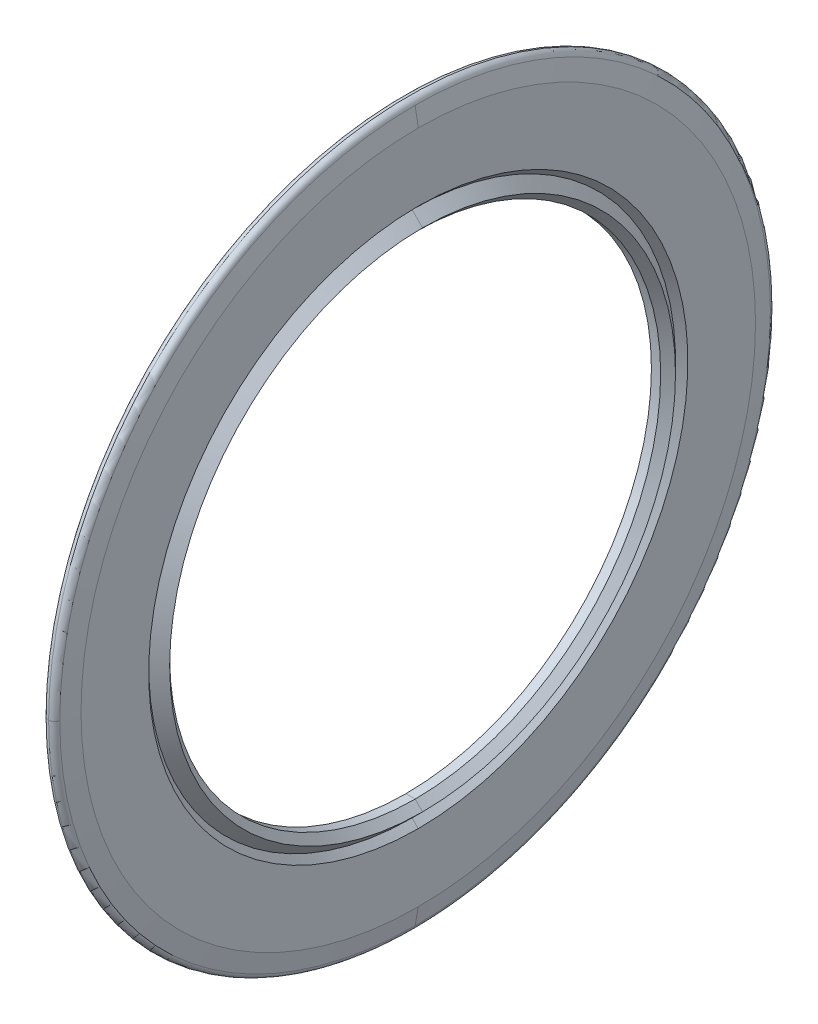
ISO-10303-21;
HEADER;
FILE_DESCRIPTION(('STEP AP214'),'2;1');
FILE_NAME('part.step','',(''),(''),'','','');
FILE_SCHEMA(('AUTOMOTIVE_DESIGN { 1 0 10303 214 1 1 1 1 }'));
ENDSEC;
DATA;
#1=APPLICATION_CONTEXT('core data for automotive mechanical design processes');
#2=APPLICATION_PROTOCOL_DEFINITION('international standard','automotive_design',2000,#1);
#3=PRODUCT_CONTEXT('',#1,'mechanical');
#4=PRODUCT('Part','Part','',(#3));
#5=PRODUCT_RELATED_PRODUCT_CATEGORY('part','',(#4));
#6=PRODUCT_DEFINITION_FORMATION('','',#4);
#7=PRODUCT_DEFINITION_CONTEXT('part definition',#1,'design');
#8=PRODUCT_DEFINITION('design','',#6,#7);
#9=PRODUCT_DEFINITION_SHAPE('','',#8);
#10=(LENGTH_UNIT() NAMED_UNIT(*) SI_UNIT(.MILLI.,.METRE.));
#11=(NAMED_UNIT(*) PLANE_ANGLE_UNIT() SI_UNIT($,.RADIAN.));
#12=(NAMED_UNIT(*) SI_UNIT($,.STERADIAN.) SOLID_ANGLE_UNIT());
#13=UNCERTAINTY_MEASURE_WITH_UNIT(LENGTH_MEASURE(1.E-05),#10,'distance_accuracy_value','');
#14=(GEOMETRIC_REPRESENTATION_CONTEXT(3) GLOBAL_UNCERTAINTY_ASSIGNED_CONTEXT((#13)) GLOBAL_UNIT_ASSIGNED_CONTEXT((#10,
#11,#12)) REPRESENTATION_CONTEXT('',''));
#15=CARTESIAN_POINT('',(0.,0.,0.));
#16=DIRECTION('',(0.,0.,1.));
#17=DIRECTION('',(1.,0.,0.));
#18=AXIS2_PLACEMENT_3D('',#15,#16,#17);
#19=CARTESIAN_POINT('',(0.23,25.73235,0.));
#20=DIRECTION('',(-1.,0.,0.));
#21=DIRECTION('',(0.,0.,1.));
#22=AXIS2_PLACEMENT_3D('',#19,#20,#21);
#23=PLANE('',#22);
#24=CARTESIAN_POINT('',(0.23,0.,0.));
#25=DIRECTION('',(1.,0.,0.));
#26=DIRECTION('',(0.,1.,0.));
#27=AXIS2_PLACEMENT_3D('',#24,#25,#26);
#28=CIRCLE('',#27,25.08835);
#29=CARTESIAN_POINT('',(0.23,25.08835,0.));
#30=VERTEX_POINT('',#29);
#31=CARTESIAN_POINT('',(0.23,-25.08835,0.));
#32=VERTEX_POINT('',#31);
#33=EDGE_CURVE('E11',#30,#32,#28,.T.);
#34=ORIENTED_EDGE('',*,*,#33,.T.);
#35=CARTESIAN_POINT('',(0.23,0.,0.));
#36=DIRECTION('',(1.,0.,0.));
#37=DIRECTION('',(0.,1.,0.));
#38=AXIS2_PLACEMENT_3D('',#35,#36,#37);
#39=CIRCLE('',#38,25.08835);
#40=EDGE_CURVE('E250',#32,#30,#39,.T.);
#41=ORIENTED_EDGE('',*,*,#40,.T.);
#42=EDGE_LOOP('',(#34,#41));
#43=FACE_BOUND('',#42,.T.);
#44=CARTESIAN_POINT('',(0.23,0.,0.));
#45=DIRECTION('',(1.,0.,0.));
#46=DIRECTION('',(0.,1.,0.));
#47=AXIS2_PLACEMENT_3D('',#44,#45,#46);
#48=CIRCLE('',#47,26.37635);
#49=CARTESIAN_POINT('',(0.23,0.,-26.37635));
#50=VERTEX_POINT('',#49);
#51=CARTESIAN_POINT('',(0.23,0.,26.37635));
#52=VERTEX_POINT('',#51);
#53=EDGE_CURVE('E271',#50,#52,#48,.T.);
#54=ORIENTED_EDGE('',*,*,#53,.F.);
#55=CARTESIAN_POINT('',(0.23,0.,0.));
#56=DIRECTION('',(1.,0.,0.));
#57=DIRECTION('',(0.,1.,0.));
#58=AXIS2_PLACEMENT_3D('',#55,#56,#57);
#59=CIRCLE('',#58,26.37635);
#60=EDGE_CURVE('E276',#52,#50,#59,.T.);
#61=ORIENTED_EDGE('',*,*,#60,.F.);
#62=EDGE_LOOP('',(#54,#61));
#63=FACE_BOUND('',#62,.T.);
#64=ADVANCED_FACE('F16',(#43,#63),#23,.T.);
#65=CARTESIAN_POINT('',(0.345,0.,0.));
#66=DIRECTION('',(-1.,0.,0.));
#67=DIRECTION('',(0.,1.,0.));
#68=AXIS2_PLACEMENT_3D('',#65,#66,#67);
#69=CONICAL_SURFACE('',#68,24.97335,0.785398163397448);
#70=DIRECTION('',(0.707106781186548,-0.707106781186547,0.));
#71=VECTOR('',#70,1.);
#72=CARTESIAN_POINT('',(0.345,24.97335,0.));
#73=LINE('',#72,#71);
#74=CARTESIAN_POINT('',(0.46,24.85835,0.));
#75=VERTEX_POINT('',#74);
#76=EDGE_CURVE('E240',#30,#75,#73,.T.);
#77=ORIENTED_EDGE('',*,*,#76,.T.);
#78=CARTESIAN_POINT('',(0.46,0.,0.));
#79=DIRECTION('',(1.,0.,0.));
#80=DIRECTION('',(0.,1.,0.));
#81=AXIS2_PLACEMENT_3D('',#78,#79,#80);
#82=CIRCLE('',#81,24.85835);
#83=CARTESIAN_POINT('',(0.46,-24.85835,0.));
#84=VERTEX_POINT('',#83);
#85=EDGE_CURVE('E23',#75,#84,#82,.T.);
#86=ORIENTED_EDGE('',*,*,#85,.T.);
#87=DIRECTION('',(-0.707106781186548,-0.707106781186547,0.));
#88=VECTOR('',#87,1.);
#89=CARTESIAN_POINT('',(0.345,-24.97335,0.));
#90=LINE('',#89,#88);
#91=EDGE_CURVE('E237',#84,#32,#90,.T.);
#92=ORIENTED_EDGE('',*,*,#91,.T.);
#93=ORIENTED_EDGE('',*,*,#33,.F.);
#94=EDGE_LOOP('',(#77,#86,#92,#93));
#95=FACE_BOUND('',#94,.T.);
#96=ADVANCED_FACE('F235',(#95),#69,.F.);
#97=CARTESIAN_POINT('',(0.46,22.67335,0.));
#98=DIRECTION('',(-1.,0.,0.));
#99=DIRECTION('',(0.,0.,1.));
#100=AXIS2_PLACEMENT_3D('',#97,#98,#99);
#101=PLANE('',#100);
#102=CARTESIAN_POINT('',(0.46,0.,0.));
#103=DIRECTION('',(1.,0.,0.));
#104=DIRECTION('',(0.,1.,0.));
#105=AXIS2_PLACEMENT_3D('',#102,#103,#104);
#106=CIRCLE('',#105,20.48835);
#107=CARTESIAN_POINT('',(0.46,20.48835,0.));
#108=VERTEX_POINT('',#107);
#109=CARTESIAN_POINT('',(0.46,-20.48835,0.));
#110=VERTEX_POINT('',#109);
#111=EDGE_CURVE('E263',#108,#110,#106,.T.);
#112=ORIENTED_EDGE('',*,*,#111,.T.);
#113=CARTESIAN_POINT('',(0.46,0.,0.));
#114=DIRECTION('',(1.,0.,0.));
#115=DIRECTION('',(0.,1.,0.));
#116=AXIS2_PLACEMENT_3D('',#113,#114,#115);
#117=CIRCLE('',#116,20.48835);
#118=EDGE_CURVE('E169',#110,#108,#117,.T.);
#119=ORIENTED_EDGE('',*,*,#118,.T.);
#120=EDGE_LOOP('',(#112,#119));
#121=FACE_BOUND('',#120,.T.);
#122=ORIENTED_EDGE('',*,*,#85,.F.);
#123=CARTESIAN_POINT('',(0.46,0.,0.));
#124=DIRECTION('',(1.,0.,0.));
#125=DIRECTION('',(0.,1.,0.));
#126=AXIS2_PLACEMENT_3D('',#123,#124,#125);
#127=CIRCLE('',#126,24.85835);
#128=EDGE_CURVE('E243',#84,#75,#127,.T.);
#129=ORIENTED_EDGE('',*,*,#128,.F.);
#130=EDGE_LOOP('',(#122,#129));
#131=FACE_BOUND('',#130,.T.);
#132=ADVANCED_FACE('F244',(#121,#131),#101,.T.);
#133=CARTESIAN_POINT('',(0.345,0.,0.));
#134=DIRECTION('',(1.,0.,0.));
#135=DIRECTION('',(0.,1.,0.));
#136=AXIS2_PLACEMENT_3D('',#133,#134,#135);
#137=CONICAL_SURFACE('',#136,20.37335,0.785398163397448);
#138=DIRECTION('',(0.707106781186548,0.707106781186547,0.));
#139=VECTOR('',#138,1.);
#140=CARTESIAN_POINT('',(0.345,20.37335,0.));
#141=LINE('',#140,#139);
#142=CARTESIAN_POINT('',(0.23,20.25835,0.));
#143=VERTEX_POINT('',#142);
#144=EDGE_CURVE('E246',#143,#108,#141,.T.);
#145=ORIENTED_EDGE('',*,*,#144,.T.);
#146=ORIENTED_EDGE('',*,*,#118,.F.);
#147=DIRECTION('',(-0.707106781186548,0.707106781186547,0.));
#148=VECTOR('',#147,1.);
#149=CARTESIAN_POINT('',(0.345,-20.37335,0.));
#150=LINE('',#149,#148);
#151=CARTESIAN_POINT('',(0.23,-20.25835,0.));
#152=VERTEX_POINT('',#151);
#153=EDGE_CURVE('E257',#110,#152,#150,.T.);
#154=ORIENTED_EDGE('',*,*,#153,.T.);
#155=CARTESIAN_POINT('',(0.23,0.,0.));
#156=DIRECTION('',(1.,0.,0.));
#157=DIRECTION('',(0.,1.,0.));
#158=AXIS2_PLACEMENT_3D('',#155,#156,#157);
#159=CIRCLE('',#158,20.25835);
#160=EDGE_CURVE('E171',#152,#143,#159,.T.);
#161=ORIENTED_EDGE('',*,*,#160,.T.);
#162=EDGE_LOOP('',(#145,#146,#154,#161));
#163=FACE_BOUND('',#162,.T.);
#164=ADVANCED_FACE('F286',(#163),#137,.T.);
#165=CARTESIAN_POINT('',(0.23,19.93635,0.));
#166=DIRECTION('',(-1.,0.,0.));
#167=DIRECTION('',(0.,0.,1.));
#168=AXIS2_PLACEMENT_3D('',#165,#166,#167);
#169=PLANE('',#168);
#170=CARTESIAN_POINT('',(0.23,0.,0.));
#171=DIRECTION('',(1.,0.,0.));
#172=DIRECTION('',(0.,1.,0.));
#173=AXIS2_PLACEMENT_3D('',#170,#171,#172);
#174=CIRCLE('',#173,19.61435);
#175=CARTESIAN_POINT('',(0.23,19.61435,0.));
#176=VERTEX_POINT('',#175);
#177=CARTESIAN_POINT('',(0.23,-19.61435,0.));
#178=VERTEX_POINT('',#177);
#179=EDGE_CURVE('E230',#176,#178,#174,.T.);
#180=ORIENTED_EDGE('',*,*,#179,.T.);
#181=CARTESIAN_POINT('',(0.23,0.,0.));
#182=DIRECTION('',(1.,0.,0.));
#183=DIRECTION('',(0.,1.,0.));
#184=AXIS2_PLACEMENT_3D('',#181,#182,#183);
#185=CIRCLE('',#184,19.61435);
#186=EDGE_CURVE('E156',#178,#176,#185,.T.);
#187=ORIENTED_EDGE('',*,*,#186,.T.);
#188=EDGE_LOOP('',(#180,#187));
#189=FACE_BOUND('',#188,.T.);
#190=CARTESIAN_POINT('',(0.23,0.,0.));
#191=DIRECTION('',(1.,0.,0.));
#192=DIRECTION('',(0.,1.,0.));
#193=AXIS2_PLACEMENT_3D('',#190,#191,#192);
#194=CIRCLE('',#193,20.25835);
#195=EDGE_CURVE('E255',#143,#152,#194,.T.);
#196=ORIENTED_EDGE('',*,*,#195,.F.);
#197=ORIENTED_EDGE('',*,*,#160,.F.);
#198=EDGE_LOOP('',(#196,#197));
#199=FACE_BOUND('',#198,.T.);
#200=ADVANCED_FACE('F288',(#189,#199),#169,.T.);
#201=CARTESIAN_POINT('',(0.6206625,0.,0.));
#202=DIRECTION('',(-1.,0.,0.));
#203=DIRECTION('',(0.,1.,0.));
#204=AXIS2_PLACEMENT_3D('',#201,#202,#203);
#205=CONICAL_SURFACE('',#204,19.2236875,0.78539816339745);
#206=DIRECTION('',(0.707106781186547,-0.707106781186548,0.));
#207=VECTOR('',#206,1.);
#208=CARTESIAN_POINT('',(0.6206625,19.2236875,0.));
#209=LINE('',#208,#207);
#210=CARTESIAN_POINT('',(1.011325,18.833025,0.));
#211=VERTEX_POINT('',#210);
#212=EDGE_CURVE('E133',#176,#211,#209,.T.);
#213=ORIENTED_EDGE('',*,*,#212,.T.);
#214=CARTESIAN_POINT('',(1.011325,0.,0.));
#215=DIRECTION('',(1.,0.,0.));
#216=DIRECTION('',(0.,1.,0.));
#217=AXIS2_PLACEMENT_3D('',#214,#215,#216);
#218=CIRCLE('',#217,18.833025);
#219=CARTESIAN_POINT('',(1.011325,-18.833025,0.));
#220=VERTEX_POINT('',#219);
#221=EDGE_CURVE('E126',#211,#220,#218,.T.);
#222=ORIENTED_EDGE('',*,*,#221,.T.);
#223=DIRECTION('',(-0.707106781186547,-0.707106781186548,0.));
#224=VECTOR('',#223,1.);
#225=CARTESIAN_POINT('',(0.6206625,-19.2236875,0.));
#226=LINE('',#225,#224);
#227=EDGE_CURVE('E130',#220,#178,#226,.T.);
#228=ORIENTED_EDGE('',*,*,#227,.T.);
#229=ORIENTED_EDGE('',*,*,#179,.F.);
#230=EDGE_LOOP('',(#213,#222,#228,#229));
#231=FACE_BOUND('',#230,.T.);
#232=ADVANCED_FACE('F128',(#231),#205,.F.);
#233=CARTESIAN_POINT('',(0.7356625,0.,0.));
#234=DIRECTION('',(1.,0.,0.));
#235=DIRECTION('',(0.,1.,0.));
#236=AXIS2_PLACEMENT_3D('',#233,#234,#235);
#237=CONICAL_SURFACE('',#236,18.5573625,0.785398163397447);
#238=DIRECTION('',(0.707106781186548,0.707106781186547,0.));
#239=VECTOR('',#238,1.);
#240=CARTESIAN_POINT('',(0.7356625,18.5573625,0.));
#241=LINE('',#240,#239);
#242=CARTESIAN_POINT('',(0.46,18.2817,0.));
#243=VERTEX_POINT('',#242);
#244=EDGE_CURVE('E151',#243,#211,#241,.T.);
#245=ORIENTED_EDGE('',*,*,#244,.T.);
#246=CARTESIAN_POINT('',(1.011325,0.,0.));
#247=DIRECTION('',(1.,0.,0.));
#248=DIRECTION('',(0.,1.,0.));
#249=AXIS2_PLACEMENT_3D('',#246,#247,#248);
#250=CIRCLE('',#249,18.833025);
#251=EDGE_CURVE('E149',#220,#211,#250,.T.);
#252=ORIENTED_EDGE('',*,*,#251,.F.);
#253=DIRECTION('',(-0.707106781186548,0.707106781186547,0.));
#254=VECTOR('',#253,1.);
#255=CARTESIAN_POINT('',(0.7356625,-18.5573625,0.));
#256=LINE('',#255,#254);
#257=CARTESIAN_POINT('',(0.46,-18.2817,0.));
#258=VERTEX_POINT('',#257);
#259=EDGE_CURVE('E138',#220,#258,#256,.T.);
#260=ORIENTED_EDGE('',*,*,#259,.T.);
#261=CARTESIAN_POINT('',(0.46,0.,0.));
#262=DIRECTION('',(1.,0.,0.));
#263=DIRECTION('',(0.,1.,0.));
#264=AXIS2_PLACEMENT_3D('',#261,#262,#263);
#265=CIRCLE('',#264,18.2817);
#266=EDGE_CURVE('E166',#258,#243,#265,.T.);
#267=ORIENTED_EDGE('',*,*,#266,.T.);
#268=EDGE_LOOP('',(#245,#252,#260,#267));
#269=FACE_BOUND('',#268,.T.);
#270=ADVANCED_FACE('F150',(#269),#237,.T.);
#271=CARTESIAN_POINT('',(0.805,0.,0.));
#272=DIRECTION('',(1.,0.,0.));
#273=DIRECTION('',(0.,1.,0.));
#274=AXIS2_PLACEMENT_3D('',#271,#272,#273);
#275=CYLINDRICAL_SURFACE('',#274,18.2817);
#276=DIRECTION('',(1.,0.,0.));
#277=VECTOR('',#276,1.);
#278=CARTESIAN_POINT('',(0.805,18.2817,0.));
#279=LINE('',#278,#277);
#280=CARTESIAN_POINT('',(1.15,18.2817,0.));
#281=VERTEX_POINT('',#280);
#282=EDGE_CURVE('E137',#243,#281,#279,.T.);
#283=ORIENTED_EDGE('',*,*,#282,.T.);
#284=CARTESIAN_POINT('',(1.15,0.,0.));
#285=DIRECTION('',(1.,0.,0.));
#286=DIRECTION('',(0.,1.,0.));
#287=AXIS2_PLACEMENT_3D('',#284,#285,#286);
#288=CIRCLE('',#287,18.2817);
#289=CARTESIAN_POINT('',(1.15,-18.2817,0.));
#290=VERTEX_POINT('',#289);
#291=EDGE_CURVE('E228',#281,#290,#288,.T.);
#292=ORIENTED_EDGE('',*,*,#291,.T.);
#293=DIRECTION('',(-1.,0.,0.));
#294=VECTOR('',#293,1.);
#295=CARTESIAN_POINT('',(0.805,-18.2817,0.));
#296=LINE('',#295,#294);
#297=EDGE_CURVE('E168',#290,#258,#296,.T.);
#298=ORIENTED_EDGE('',*,*,#297,.T.);
#299=CARTESIAN_POINT('',(0.46,0.,0.));
#300=DIRECTION('',(1.,0.,0.));
#301=DIRECTION('',(0.,1.,0.));
#302=AXIS2_PLACEMENT_3D('',#299,#300,#301);
#303=CIRCLE('',#302,18.2817);
#304=EDGE_CURVE('E145',#243,#258,#303,.T.);
#305=ORIENTED_EDGE('',*,*,#304,.F.);
#306=EDGE_LOOP('',(#283,#292,#298,#305));
#307=FACE_BOUND('',#306,.T.);
#308=ADVANCED_FACE('F347',(#307),#275,.F.);
#309=CARTESIAN_POINT('',(1.4256625,0.,0.));
#310=DIRECTION('',(1.,0.,0.));
#311=DIRECTION('',(0.,1.,0.));
#312=AXIS2_PLACEMENT_3D('',#309,#310,#311);
#313=CONICAL_SURFACE('',#312,18.5573625,0.785398163397451);
#314=DIRECTION('',(0.707106781186546,0.707106781186549,0.));
#315=VECTOR('',#314,1.);
#316=CARTESIAN_POINT('',(1.4256625,18.5573625,0.));
#317=LINE('',#316,#315);
#318=CARTESIAN_POINT('',(1.701325,18.833025,0.));
#319=VERTEX_POINT('',#318);
#320=EDGE_CURVE('E176',#281,#319,#317,.T.);
#321=ORIENTED_EDGE('',*,*,#320,.T.);
#322=CARTESIAN_POINT('',(1.701325,0.,0.));
#323=DIRECTION('',(1.,0.,0.));
#324=DIRECTION('',(0.,1.,0.));
#325=AXIS2_PLACEMENT_3D('',#322,#323,#324);
#326=CIRCLE('',#325,18.833025);
#327=CARTESIAN_POINT('',(1.701325,-18.833025,0.));
#328=VERTEX_POINT('',#327);
#329=EDGE_CURVE('E194',#319,#328,#326,.T.);
#330=ORIENTED_EDGE('',*,*,#329,.T.);
#331=DIRECTION('',(-0.707106781186546,0.707106781186549,0.));
#332=VECTOR('',#331,1.);
#333=CARTESIAN_POINT('',(1.4256625,-18.5573625,0.));
#334=LINE('',#333,#332);
#335=EDGE_CURVE('E179',#328,#290,#334,.T.);
#336=ORIENTED_EDGE('',*,*,#335,.T.);
#337=ORIENTED_EDGE('',*,*,#291,.F.);
#338=EDGE_LOOP('',(#321,#330,#336,#337));
#339=FACE_BOUND('',#338,.T.);
#340=ADVANCED_FACE('F344',(#339),#313,.F.);
#341=CARTESIAN_POINT('',(1.3106625,0.,0.));
#342=DIRECTION('',(-1.,0.,0.));
#343=DIRECTION('',(0.,1.,0.));
#344=AXIS2_PLACEMENT_3D('',#341,#342,#343);
#345=CONICAL_SURFACE('',#344,19.2236875,0.785398163397448);
#346=DIRECTION('',(0.707106781186548,-0.707106781186547,0.));
#347=VECTOR('',#346,1.);
#348=CARTESIAN_POINT('',(1.3106625,19.2236875,0.));
#349=LINE('',#348,#347);
#350=CARTESIAN_POINT('',(0.92,19.61435,0.));
#351=VERTEX_POINT('',#350);
#352=EDGE_CURVE('E185',#351,#319,#349,.T.);
#353=ORIENTED_EDGE('',*,*,#352,.T.);
#354=CARTESIAN_POINT('',(1.701325,0.,0.));
#355=DIRECTION('',(1.,0.,0.));
#356=DIRECTION('',(0.,1.,0.));
#357=AXIS2_PLACEMENT_3D('',#354,#355,#356);
#358=CIRCLE('',#357,18.833025);
#359=EDGE_CURVE('E182',#328,#319,#358,.T.);
#360=ORIENTED_EDGE('',*,*,#359,.F.);
#361=DIRECTION('',(-0.707106781186548,-0.707106781186547,0.));
#362=VECTOR('',#361,1.);
#363=CARTESIAN_POINT('',(1.3106625,-19.2236875,0.));
#364=LINE('',#363,#362);
#365=CARTESIAN_POINT('',(0.92,-19.61435,0.));
#366=VERTEX_POINT('',#365);
#367=EDGE_CURVE('E191',#328,#366,#364,.T.);
#368=ORIENTED_EDGE('',*,*,#367,.T.);
#369=CARTESIAN_POINT('',(0.92,0.,0.));
#370=DIRECTION('',(1.,0.,0.));
#371=DIRECTION('',(0.,1.,0.));
#372=AXIS2_PLACEMENT_3D('',#369,#370,#371);
#373=CIRCLE('',#372,19.61435);
#374=EDGE_CURVE('E199',#366,#351,#373,.T.);
#375=ORIENTED_EDGE('',*,*,#374,.T.);
#376=EDGE_LOOP('',(#353,#360,#368,#375));
#377=FACE_BOUND('',#376,.T.);
#378=ADVANCED_FACE('F339',(#377),#345,.T.);
#379=CARTESIAN_POINT('',(1.15,0.,0.));
#380=DIRECTION('',(1.,0.,0.));
#381=DIRECTION('',(0.,1.,0.));
#382=AXIS2_PLACEMENT_3D('',#379,#380,#381);
#383=CONICAL_SURFACE('',#382,19.84435,0.785398163397452);
#384=DIRECTION('',(0.707106781186545,0.70710678118655,0.));
#385=VECTOR('',#384,1.);
#386=CARTESIAN_POINT('',(1.15,19.84435,0.));
#387=LINE('',#386,#385);
#388=CARTESIAN_POINT('',(1.38,20.07435,0.));
#389=VERTEX_POINT('',#388);
#390=EDGE_CURVE('E196',#351,#389,#387,.T.);
#391=ORIENTED_EDGE('',*,*,#390,.T.);
#392=CARTESIAN_POINT('',(1.38,0.,0.));
#393=DIRECTION('',(1.,0.,0.));
#394=DIRECTION('',(0.,1.,0.));
#395=AXIS2_PLACEMENT_3D('',#392,#393,#394);
#396=CIRCLE('',#395,20.07435);
#397=CARTESIAN_POINT('',(1.38,-20.07435,0.));
#398=VERTEX_POINT('',#397);
#399=EDGE_CURVE('E226',#389,#398,#396,.T.);
#400=ORIENTED_EDGE('',*,*,#399,.T.);
#401=DIRECTION('',(-0.707106781186545,0.70710678118655,0.));
#402=VECTOR('',#401,1.);
#403=CARTESIAN_POINT('',(1.15,-19.84435,0.));
#404=LINE('',#403,#402);
#405=EDGE_CURVE('E201',#398,#366,#404,.T.);
#406=ORIENTED_EDGE('',*,*,#405,.T.);
#407=CARTESIAN_POINT('',(0.92,0.,0.));
#408=DIRECTION('',(1.,0.,0.));
#409=DIRECTION('',(0.,1.,0.));
#410=AXIS2_PLACEMENT_3D('',#407,#408,#409);
#411=CIRCLE('',#410,19.61435);
#412=EDGE_CURVE('E188',#351,#366,#411,.T.);
#413=ORIENTED_EDGE('',*,*,#412,.F.);
#414=EDGE_LOOP('',(#391,#400,#406,#413));
#415=FACE_BOUND('',#414,.T.);
#416=ADVANCED_FACE('F331',(#415),#383,.F.);
#417=CARTESIAN_POINT('',(1.38,22.5932749833549,0.));
#418=DIRECTION('',(1.,0.,0.));
#419=DIRECTION('',(0.,1.,0.));
#420=AXIS2_PLACEMENT_3D('',#417,#418,#419);
#421=PLANE('',#420);
#422=ORIENTED_EDGE('',*,*,#399,.F.);
#423=CARTESIAN_POINT('',(1.38,0.,0.));
#424=DIRECTION('',(1.,0.,0.));
#425=DIRECTION('',(0.,1.,0.));
#426=AXIS2_PLACEMENT_3D('',#423,#424,#425);
#427=CIRCLE('',#426,20.07435);
#428=EDGE_CURVE('E203',#398,#389,#427,.T.);
#429=ORIENTED_EDGE('',*,*,#428,.F.);
#430=EDGE_LOOP('',(#422,#429));
#431=FACE_BOUND('',#430,.T.);
#432=CARTESIAN_POINT('',(1.38,0.,0.));
#433=DIRECTION('',(1.,0.,0.));
#434=DIRECTION('',(0.,1.,0.));
#435=AXIS2_PLACEMENT_3D('',#432,#433,#434);
#436=CIRCLE('',#435,25.1121999667099);
#437=CARTESIAN_POINT('',(1.38,25.1121999667099,0.));
#438=VERTEX_POINT('',#437);
#439=CARTESIAN_POINT('',(1.38,-25.1121999667099,0.));
#440=VERTEX_POINT('',#439);
#441=EDGE_CURVE('E216',#438,#440,#436,.T.);
#442=ORIENTED_EDGE('',*,*,#441,.T.);
#443=CARTESIAN_POINT('',(1.38,0.,0.));
#444=DIRECTION('',(1.,0.,0.));
#445=DIRECTION('',(0.,1.,0.));
#446=AXIS2_PLACEMENT_3D('',#443,#444,#445);
#447=CIRCLE('',#446,25.1121999667099);
#448=EDGE_CURVE('E36',#440,#438,#447,.T.);
#449=ORIENTED_EDGE('',*,*,#448,.T.);
#450=EDGE_LOOP('',(#442,#449));
#451=FACE_BOUND('',#450,.T.);
#452=ADVANCED_FACE('F329',(#431,#451),#421,.T.);
#453=CARTESIAN_POINT('',(1.26150578319281,0.,0.));
#454=DIRECTION('',(-1.,0.,0.));
#455=DIRECTION('',(0.,1.,0.));
#456=AXIS2_PLACEMENT_3D('',#453,#454,#455);
#457=CONICAL_SURFACE('',#456,25.7842140642183,1.39626340159546);
#458=DIRECTION('',(0.173648177666931,-0.984807753012208,0.));
#459=VECTOR('',#458,1.);
#460=CARTESIAN_POINT('',(1.26150578319281,25.7842140642183,0.));
#461=LINE('',#460,#459);
#462=CARTESIAN_POINT('',(1.14301156638562,26.4562281617268,0.));
#463=VERTEX_POINT('',#462);
#464=EDGE_CURVE('E206',#463,#438,#461,.T.);
#465=ORIENTED_EDGE('',*,*,#464,.T.);
#466=ORIENTED_EDGE('',*,*,#448,.F.);
#467=DIRECTION('',(-0.173648177666931,-0.984807753012208,0.));
#468=VECTOR('',#467,1.);
#469=CARTESIAN_POINT('',(1.26150578319281,-25.7842140642183,0.));
#470=LINE('',#469,#468);
#471=CARTESIAN_POINT('',(1.14301156638562,-26.4562281617268,0.));
#472=VERTEX_POINT('',#471);
#473=EDGE_CURVE('E214',#440,#472,#470,.T.);
#474=ORIENTED_EDGE('',*,*,#473,.T.);
#475=CARTESIAN_POINT('',(1.14301156638562,0.,0.));
#476=DIRECTION('',(1.,0.,0.));
#477=DIRECTION('',(0.,1.,0.));
#478=AXIS2_PLACEMENT_3D('',#475,#476,#477);
#479=CIRCLE('',#478,26.4562281617268);
#480=CARTESIAN_POINT('',(1.14301156638562,0.,-26.4562281617268));
#481=VERTEX_POINT('',#480);
#482=EDGE_CURVE('E30',#472,#481,#479,.T.);
#483=ORIENTED_EDGE('',*,*,#482,.T.);
#484=CARTESIAN_POINT('',(1.14301156638562,0.,0.));
#485=DIRECTION('',(1.,0.,0.));
#486=DIRECTION('',(0.,1.,0.));
#487=AXIS2_PLACEMENT_3D('',#484,#485,#486);
#488=CIRCLE('',#487,26.4562281617268);
#489=EDGE_CURVE('E220',#481,#463,#488,.T.);
#490=ORIENTED_EDGE('',*,*,#489,.T.);
#491=EDGE_LOOP('',(#465,#466,#474,#483,#490));
#492=FACE_BOUND('',#491,.T.);
#493=ADVANCED_FACE('F323',(#492),#457,.T.);
#494=CARTESIAN_POINT('',(0.69,0.,0.));
#495=DIRECTION('',(1.,0.,0.));
#496=DIRECTION('',(0.,0.,-1.));
#497=AXIS2_PLACEMENT_3D('',#494,#495,#496);
#498=TOROIDAL_SURFACE('',#497,26.37635,0.46);
#499=CARTESIAN_POINT('',(0.69,0.,0.));
#500=DIRECTION('',(1.,0.,0.));
#501=DIRECTION('',(0.,0.,-1.));
#502=AXIS2_PLACEMENT_3D('',#499,#500,#501);
#503=CIRCLE('',#502,26.83635);
#504=CARTESIAN_POINT('',(0.69,0.,26.83635));
#505=VERTEX_POINT('',#504);
#506=CARTESIAN_POINT('',(0.69,0.,-26.83635));
#507=VERTEX_POINT('',#506);
#508=EDGE_CURVE('E270',#505,#507,#503,.T.);
#509=ORIENTED_EDGE('',*,*,#508,.T.);
#510=CARTESIAN_POINT('',(0.69,0.,-26.37635));
#511=DIRECTION('',(0.,-1.,0.));
#512=DIRECTION('',(0.,0.,-1.));
#513=AXIS2_PLACEMENT_3D('',#510,#511,#512);
#514=CIRCLE('',#513,0.46);
#515=EDGE_CURVE('E222',#507,#481,#514,.T.);
#516=ORIENTED_EDGE('',*,*,#515,.T.);
#517=ORIENTED_EDGE('',*,*,#482,.F.);
#518=CARTESIAN_POINT('',(1.14301156638562,0.,0.));
#519=DIRECTION('',(1.,0.,0.));
#520=DIRECTION('',(0.,1.,0.));
#521=AXIS2_PLACEMENT_3D('',#518,#519,#520);
#522=CIRCLE('',#521,26.4562281617268);
#523=CARTESIAN_POINT('',(1.14301156638562,0.,26.4562281617268));
#524=VERTEX_POINT('',#523);
#525=EDGE_CURVE('E211',#524,#472,#522,.T.);
#526=ORIENTED_EDGE('',*,*,#525,.F.);
#527=CARTESIAN_POINT('',(0.69,0.,26.37635));
#528=DIRECTION('',(0.,-1.,0.));
#529=DIRECTION('',(0.,0.,1.));
#530=AXIS2_PLACEMENT_3D('',#527,#528,#529);
#531=CIRCLE('',#530,0.46);
#532=EDGE_CURVE('E218',#524,#505,#531,.T.);
#533=ORIENTED_EDGE('',*,*,#532,.T.);
#534=EDGE_LOOP('',(#509,#516,#517,#526,#533));
#535=FACE_BOUND('',#534,.T.);
#536=ADVANCED_FACE('F316',(#535),#498,.T.);
#537=CARTESIAN_POINT('',(0.69,0.,0.));
#538=DIRECTION('',(1.,0.,0.));
#539=DIRECTION('',(0.,0.,-1.));
#540=AXIS2_PLACEMENT_3D('',#537,#538,#539);
#541=TOROIDAL_SURFACE('',#540,26.37635,0.46);
#542=CARTESIAN_POINT('',(0.69,0.,0.));
#543=DIRECTION('',(1.,0.,0.));
#544=DIRECTION('',(0.,0.,-1.));
#545=AXIS2_PLACEMENT_3D('',#542,#543,#544);
#546=CIRCLE('',#545,26.83635);
#547=EDGE_CURVE('E273',#507,#505,#546,.T.);
#548=ORIENTED_EDGE('',*,*,#547,.T.);
#549=ORIENTED_EDGE('',*,*,#532,.F.);
#550=CARTESIAN_POINT('',(1.14301156638562,0.,0.));
#551=DIRECTION('',(1.,0.,0.));
#552=DIRECTION('',(0.,1.,0.));
#553=AXIS2_PLACEMENT_3D('',#550,#551,#552);
#554=CIRCLE('',#553,26.4562281617268);
#555=EDGE_CURVE('E208',#463,#524,#554,.T.);
#556=ORIENTED_EDGE('',*,*,#555,.F.);
#557=ORIENTED_EDGE('',*,*,#489,.F.);
#558=ORIENTED_EDGE('',*,*,#515,.F.);
#559=EDGE_LOOP('',(#548,#549,#556,#557,#558));
#560=FACE_BOUND('',#559,.T.);
#561=ADVANCED_FACE('F321',(#560),#541,.T.);
#562=CARTESIAN_POINT('',(1.26150578319281,0.,0.));
#563=DIRECTION('',(-1.,0.,0.));
#564=DIRECTION('',(0.,1.,0.));
#565=AXIS2_PLACEMENT_3D('',#562,#563,#564);
#566=CONICAL_SURFACE('',#565,25.7842140642183,1.39626340159546);
#567=ORIENTED_EDGE('',*,*,#464,.F.);
#568=ORIENTED_EDGE('',*,*,#555,.T.);
#569=ORIENTED_EDGE('',*,*,#525,.T.);
#570=ORIENTED_EDGE('',*,*,#473,.F.);
#571=ORIENTED_EDGE('',*,*,#441,.F.);
#572=EDGE_LOOP('',(#567,#568,#569,#570,#571));
#573=FACE_BOUND('',#572,.T.);
#574=ADVANCED_FACE('F326',(#573),#566,.T.);
#575=CARTESIAN_POINT('',(1.15,0.,0.));
#576=DIRECTION('',(1.,0.,0.));
#577=DIRECTION('',(0.,1.,0.));
#578=AXIS2_PLACEMENT_3D('',#575,#576,#577);
#579=CONICAL_SURFACE('',#578,19.84435,0.785398163397452);
#580=ORIENTED_EDGE('',*,*,#390,.F.);
#581=ORIENTED_EDGE('',*,*,#374,.F.);
#582=ORIENTED_EDGE('',*,*,#405,.F.);
#583=ORIENTED_EDGE('',*,*,#428,.T.);
#584=EDGE_LOOP('',(#580,#581,#582,#583));
#585=FACE_BOUND('',#584,.T.);
#586=ADVANCED_FACE('F428',(#585),#579,.F.);
#587=CARTESIAN_POINT('',(1.3106625,0.,0.));
#588=DIRECTION('',(-1.,0.,0.));
#589=DIRECTION('',(0.,1.,0.));
#590=AXIS2_PLACEMENT_3D('',#587,#588,#589);
#591=CONICAL_SURFACE('',#590,19.2236875,0.785398163397448);
#592=ORIENTED_EDGE('',*,*,#352,.F.);
#593=ORIENTED_EDGE('',*,*,#412,.T.);
#594=ORIENTED_EDGE('',*,*,#367,.F.);
#595=ORIENTED_EDGE('',*,*,#329,.F.);
#596=EDGE_LOOP('',(#592,#593,#594,#595));
#597=FACE_BOUND('',#596,.T.);
#598=ADVANCED_FACE('F437',(#597),#591,.T.);
#599=CARTESIAN_POINT('',(1.4256625,0.,0.));
#600=DIRECTION('',(1.,0.,0.));
#601=DIRECTION('',(0.,1.,0.));
#602=AXIS2_PLACEMENT_3D('',#599,#600,#601);
#603=CONICAL_SURFACE('',#602,18.5573625,0.785398163397451);
#604=ORIENTED_EDGE('',*,*,#320,.F.);
#605=CARTESIAN_POINT('',(1.15,0.,0.));
#606=DIRECTION('',(1.,0.,0.));
#607=DIRECTION('',(0.,1.,0.));
#608=AXIS2_PLACEMENT_3D('',#605,#606,#607);
#609=CIRCLE('',#608,18.2817);
#610=EDGE_CURVE('E173',#290,#281,#609,.T.);
#611=ORIENTED_EDGE('',*,*,#610,.F.);
#612=ORIENTED_EDGE('',*,*,#335,.F.);
#613=ORIENTED_EDGE('',*,*,#359,.T.);
#614=EDGE_LOOP('',(#604,#611,#612,#613));
#615=FACE_BOUND('',#614,.T.);
#616=ADVANCED_FACE('F447',(#615),#603,.F.);
#617=CARTESIAN_POINT('',(0.805,0.,0.));
#618=DIRECTION('',(1.,0.,0.));
#619=DIRECTION('',(0.,1.,0.));
#620=AXIS2_PLACEMENT_3D('',#617,#618,#619);
#621=CYLINDRICAL_SURFACE('',#620,18.2817);
#622=ORIENTED_EDGE('',*,*,#282,.F.);
#623=ORIENTED_EDGE('',*,*,#266,.F.);
#624=ORIENTED_EDGE('',*,*,#297,.F.);
#625=ORIENTED_EDGE('',*,*,#610,.T.);
#626=EDGE_LOOP('',(#622,#623,#624,#625));
#627=FACE_BOUND('',#626,.T.);
#628=ADVANCED_FACE('F457',(#627),#621,.F.);
#629=CARTESIAN_POINT('',(0.7356625,0.,0.));
#630=DIRECTION('',(1.,0.,0.));
#631=DIRECTION('',(0.,1.,0.));
#632=AXIS2_PLACEMENT_3D('',#629,#630,#631);
#633=CONICAL_SURFACE('',#632,18.5573625,0.785398163397447);
#634=ORIENTED_EDGE('',*,*,#244,.F.);
#635=ORIENTED_EDGE('',*,*,#304,.T.);
#636=ORIENTED_EDGE('',*,*,#259,.F.);
#637=ORIENTED_EDGE('',*,*,#221,.F.);
#638=EDGE_LOOP('',(#634,#635,#636,#637));
#639=FACE_BOUND('',#638,.T.);
#640=ADVANCED_FACE('F143',(#639),#633,.T.);
#641=CARTESIAN_POINT('',(0.6206625,0.,0.));
#642=DIRECTION('',(-1.,0.,0.));
#643=DIRECTION('',(0.,1.,0.));
#644=AXIS2_PLACEMENT_3D('',#641,#642,#643);
#645=CONICAL_SURFACE('',#644,19.2236875,0.78539816339745);
#646=ORIENTED_EDGE('',*,*,#212,.F.);
#647=ORIENTED_EDGE('',*,*,#186,.F.);
#648=ORIENTED_EDGE('',*,*,#227,.F.);
#649=ORIENTED_EDGE('',*,*,#251,.T.);
#650=EDGE_LOOP('',(#646,#647,#648,#649));
#651=FACE_BOUND('',#650,.T.);
#652=ADVANCED_FACE('F154',(#651),#645,.F.);
#653=CARTESIAN_POINT('',(0.345,0.,0.));
#654=DIRECTION('',(1.,0.,0.));
#655=DIRECTION('',(0.,1.,0.));
#656=AXIS2_PLACEMENT_3D('',#653,#654,#655);
#657=CONICAL_SURFACE('',#656,20.37335,0.785398163397448);
#658=ORIENTED_EDGE('',*,*,#144,.F.);
#659=ORIENTED_EDGE('',*,*,#195,.T.);
#660=ORIENTED_EDGE('',*,*,#153,.F.);
#661=ORIENTED_EDGE('',*,*,#111,.F.);
#662=EDGE_LOOP('',(#658,#659,#660,#661));
#663=FACE_BOUND('',#662,.T.);
#664=ADVANCED_FACE('F290',(#663),#657,.T.);
#665=CARTESIAN_POINT('',(0.345,0.,0.));
#666=DIRECTION('',(-1.,0.,0.));
#667=DIRECTION('',(0.,1.,0.));
#668=AXIS2_PLACEMENT_3D('',#665,#666,#667);
#669=CONICAL_SURFACE('',#668,24.97335,0.785398163397448);
#670=ORIENTED_EDGE('',*,*,#76,.F.);
#671=ORIENTED_EDGE('',*,*,#40,.F.);
#672=ORIENTED_EDGE('',*,*,#91,.F.);
#673=ORIENTED_EDGE('',*,*,#128,.T.);
#674=EDGE_LOOP('',(#670,#671,#672,#673));
#675=FACE_BOUND('',#674,.T.);
#676=ADVANCED_FACE('F248',(#675),#669,.F.);
#677=CARTESIAN_POINT('',(0.69,0.,0.));
#678=DIRECTION('',(1.,0.,0.));
#679=DIRECTION('',(0.,0.,-1.));
#680=AXIS2_PLACEMENT_3D('',#677,#678,#679);
#681=TOROIDAL_SURFACE('',#680,26.37635,0.46);
#682=ORIENTED_EDGE('',*,*,#547,.F.);
#683=CARTESIAN_POINT('',(0.69,0.,-26.37635));
#684=DIRECTION('',(0.,-1.,0.));
#685=DIRECTION('',(0.,0.,-1.));
#686=AXIS2_PLACEMENT_3D('',#683,#684,#685);
#687=CIRCLE('',#686,0.46);
#688=EDGE_CURVE('E280',#50,#507,#687,.T.);
#689=ORIENTED_EDGE('',*,*,#688,.F.);
#690=ORIENTED_EDGE('',*,*,#53,.T.);
#691=CARTESIAN_POINT('',(0.69,0.,26.37635));
#692=DIRECTION('',(0.,-1.,0.));
#693=DIRECTION('',(0.,0.,1.));
#694=AXIS2_PLACEMENT_3D('',#691,#692,#693);
#695=CIRCLE('',#694,0.46);
#696=EDGE_CURVE('E274',#505,#52,#695,.T.);
#697=ORIENTED_EDGE('',*,*,#696,.F.);
#698=EDGE_LOOP('',(#682,#689,#690,#697));
#699=FACE_BOUND('',#698,.T.);
#700=ADVANCED_FACE('F310',(#699),#681,.T.);
#701=CARTESIAN_POINT('',(0.69,0.,0.));
#702=DIRECTION('',(1.,0.,0.));
#703=DIRECTION('',(0.,0.,-1.));
#704=AXIS2_PLACEMENT_3D('',#701,#702,#703);
#705=TOROIDAL_SURFACE('',#704,26.37635,0.46);
#706=ORIENTED_EDGE('',*,*,#508,.F.);
#707=ORIENTED_EDGE('',*,*,#696,.T.);
#708=ORIENTED_EDGE('',*,*,#60,.T.);
#709=ORIENTED_EDGE('',*,*,#688,.T.);
#710=EDGE_LOOP('',(#706,#707,#708,#709));
#711=FACE_BOUND('',#710,.T.);
#712=ADVANCED_FACE('F314',(#711),#705,.T.);
#713=CLOSED_SHELL('',(#64,#96,#132,#164,#200,#232,#270,#308,#340,#378,#416,#452,#493,#536,#561,
#574,#586,#598,#616,#628,#640,#652,#664,#676,#700,#712));
#714=MANIFOLD_SOLID_BREP('B1',#713);
#715=ADVANCED_BREP_SHAPE_REPRESENTATION('',(#18,#714),#14);
#716=SHAPE_DEFINITION_REPRESENTATION(#9,#715);
ENDSEC;
END-ISO-10303-21;
